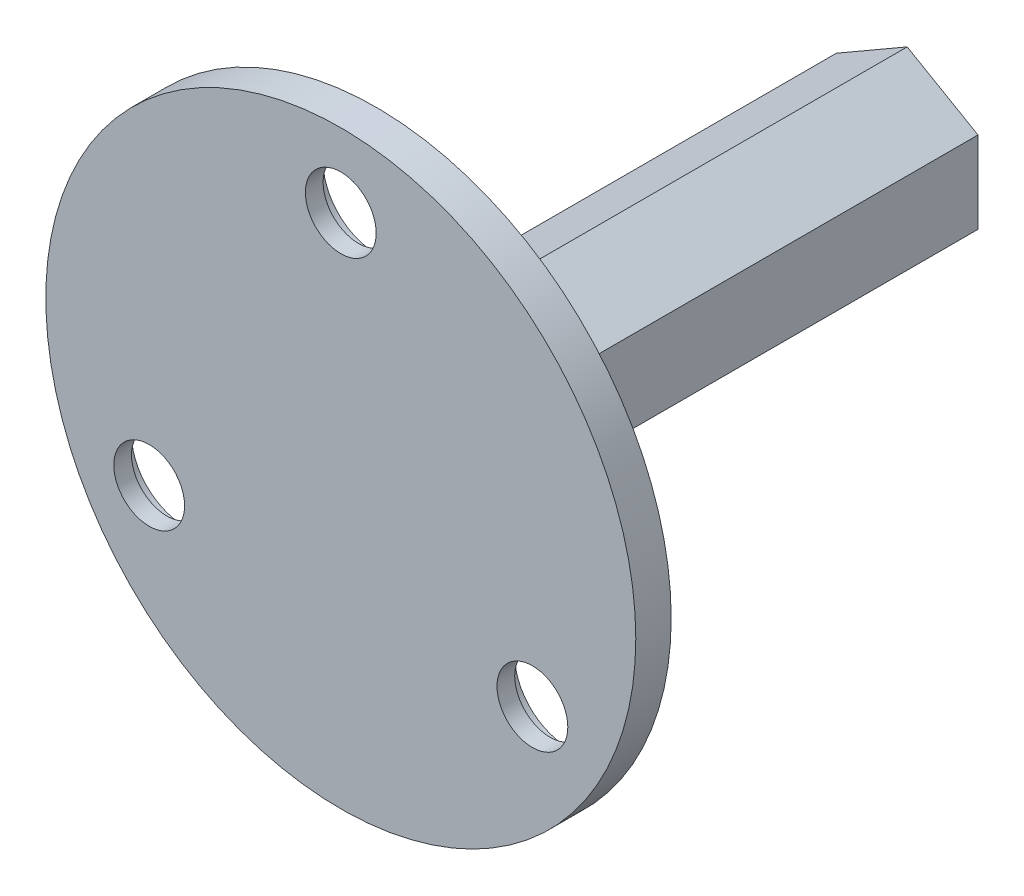
ISO-10303-21;
HEADER;
FILE_DESCRIPTION(('STEP AP214'),'2;1');
FILE_NAME('part.step','',(''),(''),'','','');
FILE_SCHEMA(('AUTOMOTIVE_DESIGN { 1 0 10303 214 1 1 1 1 }'));
ENDSEC;
DATA;
#1=APPLICATION_CONTEXT('core data for automotive mechanical design processes');
#2=APPLICATION_PROTOCOL_DEFINITION('international standard','automotive_design',2000,#1);
#3=PRODUCT_CONTEXT('',#1,'mechanical');
#4=PRODUCT('Part','Part','',(#3));
#5=PRODUCT_RELATED_PRODUCT_CATEGORY('part','',(#4));
#6=PRODUCT_DEFINITION_FORMATION('','',#4);
#7=PRODUCT_DEFINITION_CONTEXT('part definition',#1,'design');
#8=PRODUCT_DEFINITION('design','',#6,#7);
#9=PRODUCT_DEFINITION_SHAPE('','',#8);
#10=(LENGTH_UNIT() NAMED_UNIT(*) SI_UNIT(.MILLI.,.METRE.));
#11=(NAMED_UNIT(*) PLANE_ANGLE_UNIT() SI_UNIT($,.RADIAN.));
#12=(NAMED_UNIT(*) SI_UNIT($,.STERADIAN.) SOLID_ANGLE_UNIT());
#13=UNCERTAINTY_MEASURE_WITH_UNIT(LENGTH_MEASURE(1.E-05),#10,'distance_accuracy_value','');
#14=(GEOMETRIC_REPRESENTATION_CONTEXT(3) GLOBAL_UNCERTAINTY_ASSIGNED_CONTEXT((#13)) GLOBAL_UNIT_ASSIGNED_CONTEXT((#10,
#11,#12)) REPRESENTATION_CONTEXT('',''));
#15=CARTESIAN_POINT('',(0.,0.,0.));
#16=DIRECTION('',(0.,0.,1.));
#17=DIRECTION('',(1.,0.,0.));
#18=AXIS2_PLACEMENT_3D('',#15,#16,#17);
#19=CARTESIAN_POINT('',(-16.2379763209582,-9.37500000000001,3.));
#20=DIRECTION('',(0.,0.,-1.));
#21=DIRECTION('',(-1.,0.,0.));
#22=AXIS2_PLACEMENT_3D('',#19,#20,#21);
#23=CYLINDRICAL_SURFACE('',#22,3.);
#24=CARTESIAN_POINT('',(-16.2379763209582,-9.37500000000001,3.));
#25=DIRECTION('',(0.,0.,1.));
#26=DIRECTION('',(1.,0.,0.));
#27=AXIS2_PLACEMENT_3D('',#24,#25,#26);
#28=CIRCLE('',#27,3.);
#29=CARTESIAN_POINT('',(-13.2379763209582,-9.37500000000001,3.));
#30=VERTEX_POINT('',#29);
#31=EDGE_CURVE('E123',#30,#30,#28,.T.);
#32=ORIENTED_EDGE('',*,*,#31,.T.);
#33=EDGE_LOOP('',(#32));
#34=FACE_BOUND('',#33,.T.);
#35=CARTESIAN_POINT('',(-16.2379763209582,-9.37500000000001,1.5));
#36=DIRECTION('',(0.,0.,-1.));
#37=DIRECTION('',(-1.,0.,0.));
#38=AXIS2_PLACEMENT_3D('',#35,#36,#37);
#39=CIRCLE('',#38,3.);
#40=CARTESIAN_POINT('',(-19.2379763209582,-9.37500000000001,1.5));
#41=VERTEX_POINT('',#40);
#42=EDGE_CURVE('E43',#41,#41,#39,.T.);
#43=ORIENTED_EDGE('',*,*,#42,.T.);
#44=EDGE_LOOP('',(#43));
#45=FACE_BOUND('',#44,.T.);
#46=ADVANCED_FACE('F39',(#34,#45),#23,.F.);
#47=CARTESIAN_POINT('',(16.2379763209582,-9.37499999999999,3.));
#48=DIRECTION('',(0.,0.,-1.));
#49=DIRECTION('',(-1.,0.,0.));
#50=AXIS2_PLACEMENT_3D('',#47,#48,#49);
#51=CYLINDRICAL_SURFACE('',#50,3.);
#52=CARTESIAN_POINT('',(16.2379763209582,-9.37499999999999,3.));
#53=DIRECTION('',(0.,0.,1.));
#54=DIRECTION('',(1.,0.,0.));
#55=AXIS2_PLACEMENT_3D('',#52,#53,#54);
#56=CIRCLE('',#55,3.);
#57=CARTESIAN_POINT('',(19.2379763209582,-9.37499999999999,3.));
#58=VERTEX_POINT('',#57);
#59=EDGE_CURVE('E132',#58,#58,#56,.T.);
#60=ORIENTED_EDGE('',*,*,#59,.T.);
#61=EDGE_LOOP('',(#60));
#62=FACE_BOUND('',#61,.T.);
#63=CARTESIAN_POINT('',(16.2379763209582,-9.37499999999999,1.5));
#64=DIRECTION('',(0.,0.,-1.));
#65=DIRECTION('',(-1.,0.,0.));
#66=AXIS2_PLACEMENT_3D('',#63,#64,#65);
#67=CIRCLE('',#66,3.);
#68=CARTESIAN_POINT('',(13.2379763209582,-9.37499999999999,1.5));
#69=VERTEX_POINT('',#68);
#70=EDGE_CURVE('E154',#69,#69,#67,.T.);
#71=ORIENTED_EDGE('',*,*,#70,.T.);
#72=EDGE_LOOP('',(#71));
#73=FACE_BOUND('',#72,.T.);
#74=ADVANCED_FACE('F254',(#62,#73),#51,.F.);
#75=CARTESIAN_POINT('',(0.,18.75,3.));
#76=DIRECTION('',(0.,0.,-1.));
#77=DIRECTION('',(-1.,0.,0.));
#78=AXIS2_PLACEMENT_3D('',#75,#76,#77);
#79=CYLINDRICAL_SURFACE('',#78,3.);
#80=CARTESIAN_POINT('',(0.,18.75,3.));
#81=DIRECTION('',(0.,0.,1.));
#82=DIRECTION('',(1.,0.,0.));
#83=AXIS2_PLACEMENT_3D('',#80,#81,#82);
#84=CIRCLE('',#83,3.);
#85=CARTESIAN_POINT('',(3.,18.75,3.));
#86=VERTEX_POINT('',#85);
#87=EDGE_CURVE('E136',#86,#86,#84,.T.);
#88=ORIENTED_EDGE('',*,*,#87,.T.);
#89=EDGE_LOOP('',(#88));
#90=FACE_BOUND('',#89,.T.);
#91=CARTESIAN_POINT('',(0.,18.75,1.5));
#92=DIRECTION('',(0.,0.,-1.));
#93=DIRECTION('',(-1.,0.,0.));
#94=AXIS2_PLACEMENT_3D('',#91,#92,#93);
#95=CIRCLE('',#94,3.);
#96=CARTESIAN_POINT('',(-3.,18.75,1.5));
#97=VERTEX_POINT('',#96);
#98=EDGE_CURVE('E151',#97,#97,#95,.T.);
#99=ORIENTED_EDGE('',*,*,#98,.T.);
#100=EDGE_LOOP('',(#99));
#101=FACE_BOUND('',#100,.T.);
#102=ADVANCED_FACE('F261',(#90,#101),#79,.F.);
#103=CARTESIAN_POINT('',(0.,0.,0.));
#104=DIRECTION('',(0.,0.,1.));
#105=DIRECTION('',(1.,0.,0.));
#106=AXIS2_PLACEMENT_3D('',#103,#104,#105);
#107=PLANE('',#106);
#108=CARTESIAN_POINT('',(0.,0.,0.));
#109=DIRECTION('',(0.,0.,1.));
#110=DIRECTION('',(1.,0.,0.));
#111=AXIS2_PLACEMENT_3D('',#108,#109,#110);
#112=CIRCLE('',#111,7.5);
#113=CARTESIAN_POINT('',(7.5,0.,0.));
#114=VERTEX_POINT('',#113);
#115=EDGE_CURVE('E49',#114,#114,#112,.F.);
#116=ORIENTED_EDGE('',*,*,#115,.F.);
#117=EDGE_LOOP('',(#116));
#118=FACE_BOUND('',#117,.T.);
#119=CARTESIAN_POINT('',(0.,0.,0.));
#120=DIRECTION('',(0.,0.,-1.));
#121=DIRECTION('',(-1.,0.,0.));
#122=AXIS2_PLACEMENT_3D('',#119,#120,#121);
#123=CIRCLE('',#122,11.);
#124=CARTESIAN_POINT('',(-11.,0.,0.));
#125=VERTEX_POINT('',#124);
#126=EDGE_CURVE('E162',#125,#125,#123,.T.);
#127=ORIENTED_EDGE('',*,*,#126,.T.);
#128=EDGE_LOOP('',(#127));
#129=FACE_BOUND('',#128,.T.);
#130=ADVANCED_FACE('F270',(#118,#129),#107,.F.);
#131=CARTESIAN_POINT('',(0.,0.,-10.));
#132=DIRECTION('',(0.,0.,1.));
#133=DIRECTION('',(1.,0.,0.));
#134=AXIS2_PLACEMENT_3D('',#131,#132,#133);
#135=CYLINDRICAL_SURFACE('',#134,7.5);
#136=CARTESIAN_POINT('',(0.,0.,-10.));
#137=DIRECTION('',(0.,0.,-1.));
#138=DIRECTION('',(-1.,0.,0.));
#139=AXIS2_PLACEMENT_3D('',#136,#137,#138);
#140=CIRCLE('',#139,7.5);
#141=CARTESIAN_POINT('',(-7.5,0.,-10.));
#142=VERTEX_POINT('',#141);
#143=EDGE_CURVE('E118',#142,#142,#140,.T.);
#144=ORIENTED_EDGE('',*,*,#143,.F.);
#145=EDGE_LOOP('',(#144));
#146=FACE_BOUND('',#145,.T.);
#147=ORIENTED_EDGE('',*,*,#115,.T.);
#148=EDGE_LOOP('',(#147));
#149=FACE_BOUND('',#148,.T.);
#150=ADVANCED_FACE('F265',(#146,#149),#135,.T.);
#151=CARTESIAN_POINT('',(0.,0.,-10.));
#152=DIRECTION('',(0.,0.,-1.));
#153=DIRECTION('',(-1.,0.,0.));
#154=AXIS2_PLACEMENT_3D('',#151,#152,#153);
#155=PLANE('',#154);
#156=DIRECTION('',(-0.866025403784439,-0.5,0.));
#157=VECTOR('',#156,1.);
#158=CARTESIAN_POINT('',(6.,-3.46410161513776,-10.));
#159=LINE('',#158,#157);
#160=CARTESIAN_POINT('',(6.,-3.46410161513776,-10.));
#161=VERTEX_POINT('',#160);
#162=CARTESIAN_POINT('',(0.,-6.92820323027551,-10.));
#163=VERTEX_POINT('',#162);
#164=EDGE_CURVE('E57',#161,#163,#159,.T.);
#165=ORIENTED_EDGE('',*,*,#164,.F.);
#166=DIRECTION('',(0.,-1.,0.));
#167=VECTOR('',#166,1.);
#168=CARTESIAN_POINT('',(6.,3.46410161513776,-10.));
#169=LINE('',#168,#167);
#170=CARTESIAN_POINT('',(6.,3.46410161513776,-10.));
#171=VERTEX_POINT('',#170);
#172=EDGE_CURVE('E61',#171,#161,#169,.T.);
#173=ORIENTED_EDGE('',*,*,#172,.F.);
#174=DIRECTION('',(0.866025403784439,-0.5,0.));
#175=VECTOR('',#174,1.);
#176=CARTESIAN_POINT('',(0.,6.92820323027551,-10.));
#177=LINE('',#176,#175);
#178=CARTESIAN_POINT('',(0.,6.92820323027551,-10.));
#179=VERTEX_POINT('',#178);
#180=EDGE_CURVE('E212',#179,#171,#177,.T.);
#181=ORIENTED_EDGE('',*,*,#180,.F.);
#182=DIRECTION('',(0.866025403784439,0.5,0.));
#183=VECTOR('',#182,1.);
#184=CARTESIAN_POINT('',(-6.,3.46410161513776,-10.));
#185=LINE('',#184,#183);
#186=CARTESIAN_POINT('',(-6.,3.46410161513776,-10.));
#187=VERTEX_POINT('',#186);
#188=EDGE_CURVE('E208',#187,#179,#185,.T.);
#189=ORIENTED_EDGE('',*,*,#188,.F.);
#190=DIRECTION('',(0.,1.,0.));
#191=VECTOR('',#190,1.);
#192=CARTESIAN_POINT('',(-6.,-3.46410161513775,-10.));
#193=LINE('',#192,#191);
#194=CARTESIAN_POINT('',(-6.,-3.46410161513775,-10.));
#195=VERTEX_POINT('',#194);
#196=EDGE_CURVE('E204',#195,#187,#193,.T.);
#197=ORIENTED_EDGE('',*,*,#196,.F.);
#198=DIRECTION('',(-0.866025403784438,0.5,0.));
#199=VECTOR('',#198,1.);
#200=CARTESIAN_POINT('',(0.,-6.92820323027551,-10.));
#201=LINE('',#200,#199);
#202=EDGE_CURVE('E201',#163,#195,#201,.T.);
#203=ORIENTED_EDGE('',*,*,#202,.F.);
#204=EDGE_LOOP('',(#165,#173,#181,#189,#197,#203));
#205=FACE_BOUND('',#204,.T.);
#206=ORIENTED_EDGE('',*,*,#143,.T.);
#207=EDGE_LOOP('',(#206));
#208=FACE_BOUND('',#207,.T.);
#209=ADVANCED_FACE('F235',(#205,#208),#155,.T.);
#210=CARTESIAN_POINT('',(6.,-3.46410161513776,-45.));
#211=DIRECTION('',(-0.5,0.866025403784439,0.));
#212=DIRECTION('',(-0.866025403784439,-0.5,0.));
#213=AXIS2_PLACEMENT_3D('',#210,#211,#212);
#214=PLANE('',#213);
#215=ORIENTED_EDGE('',*,*,#164,.T.);
#216=DIRECTION('',(0.,0.,1.));
#217=VECTOR('',#216,1.);
#218=CARTESIAN_POINT('',(0.,-6.92820323027551,-45.));
#219=LINE('',#218,#217);
#220=CARTESIAN_POINT('',(0.,-6.92820323027551,-45.));
#221=VERTEX_POINT('',#220);
#222=EDGE_CURVE('E98',#221,#163,#219,.T.);
#223=ORIENTED_EDGE('',*,*,#222,.F.);
#224=DIRECTION('',(-0.866025403784439,-0.5,0.));
#225=VECTOR('',#224,1.);
#226=CARTESIAN_POINT('',(6.,-3.46410161513776,-45.));
#227=LINE('',#226,#225);
#228=CARTESIAN_POINT('',(6.,-3.46410161513776,-45.));
#229=VERTEX_POINT('',#228);
#230=EDGE_CURVE('E105',#229,#221,#227,.T.);
#231=ORIENTED_EDGE('',*,*,#230,.F.);
#232=DIRECTION('',(0.,0.,1.));
#233=VECTOR('',#232,1.);
#234=CARTESIAN_POINT('',(6.,-3.46410161513776,-45.));
#235=LINE('',#234,#233);
#236=EDGE_CURVE('E198',#229,#161,#235,.T.);
#237=ORIENTED_EDGE('',*,*,#236,.T.);
#238=EDGE_LOOP('',(#215,#223,#231,#237));
#239=FACE_BOUND('',#238,.T.);
#240=ADVANCED_FACE('F116',(#239),#214,.F.);
#241=CARTESIAN_POINT('',(0.,-6.92820323027551,-45.));
#242=DIRECTION('',(0.5,0.866025403784438,0.));
#243=DIRECTION('',(-0.866025403784438,0.5,0.));
#244=AXIS2_PLACEMENT_3D('',#241,#242,#243);
#245=PLANE('',#244);
#246=ORIENTED_EDGE('',*,*,#202,.T.);
#247=DIRECTION('',(0.,0.,1.));
#248=VECTOR('',#247,1.);
#249=CARTESIAN_POINT('',(-6.,-3.46410161513775,-45.));
#250=LINE('',#249,#248);
#251=CARTESIAN_POINT('',(-6.,-3.46410161513775,-45.));
#252=VERTEX_POINT('',#251);
#253=EDGE_CURVE('E100',#252,#195,#250,.T.);
#254=ORIENTED_EDGE('',*,*,#253,.F.);
#255=DIRECTION('',(-0.866025403784438,0.5,0.));
#256=VECTOR('',#255,1.);
#257=CARTESIAN_POINT('',(0.,-6.92820323027551,-45.));
#258=LINE('',#257,#256);
#259=EDGE_CURVE('E93',#221,#252,#258,.T.);
#260=ORIENTED_EDGE('',*,*,#259,.F.);
#261=ORIENTED_EDGE('',*,*,#222,.T.);
#262=EDGE_LOOP('',(#246,#254,#260,#261));
#263=FACE_BOUND('',#262,.T.);
#264=ADVANCED_FACE('F96',(#263),#245,.F.);
#265=CARTESIAN_POINT('',(-6.,-3.46410161513775,-45.));
#266=DIRECTION('',(1.,0.,0.));
#267=DIRECTION('',(0.,1.,0.));
#268=AXIS2_PLACEMENT_3D('',#265,#266,#267);
#269=PLANE('',#268);
#270=ORIENTED_EDGE('',*,*,#196,.T.);
#271=DIRECTION('',(0.,0.,1.));
#272=VECTOR('',#271,1.);
#273=CARTESIAN_POINT('',(-6.,3.46410161513776,-45.));
#274=LINE('',#273,#272);
#275=CARTESIAN_POINT('',(-6.,3.46410161513776,-45.));
#276=VERTEX_POINT('',#275);
#277=EDGE_CURVE('E125',#276,#187,#274,.T.);
#278=ORIENTED_EDGE('',*,*,#277,.F.);
#279=DIRECTION('',(0.,1.,0.));
#280=VECTOR('',#279,1.);
#281=CARTESIAN_POINT('',(-6.,-3.46410161513775,-45.));
#282=LINE('',#281,#280);
#283=EDGE_CURVE('E104',#252,#276,#282,.T.);
#284=ORIENTED_EDGE('',*,*,#283,.F.);
#285=ORIENTED_EDGE('',*,*,#253,.T.);
#286=EDGE_LOOP('',(#270,#278,#284,#285));
#287=FACE_BOUND('',#286,.T.);
#288=ADVANCED_FACE('F234',(#287),#269,.F.);
#289=CARTESIAN_POINT('',(-6.,3.46410161513776,-45.));
#290=DIRECTION('',(0.5,-0.866025403784439,0.));
#291=DIRECTION('',(0.866025403784439,0.5,0.));
#292=AXIS2_PLACEMENT_3D('',#289,#290,#291);
#293=PLANE('',#292);
#294=ORIENTED_EDGE('',*,*,#188,.T.);
#295=DIRECTION('',(0.,0.,1.));
#296=VECTOR('',#295,1.);
#297=CARTESIAN_POINT('',(0.,6.92820323027551,-45.));
#298=LINE('',#297,#296);
#299=CARTESIAN_POINT('',(0.,6.92820323027551,-45.));
#300=VERTEX_POINT('',#299);
#301=EDGE_CURVE('E223',#300,#179,#298,.T.);
#302=ORIENTED_EDGE('',*,*,#301,.F.);
#303=DIRECTION('',(0.866025403784439,0.5,0.));
#304=VECTOR('',#303,1.);
#305=CARTESIAN_POINT('',(-6.,3.46410161513776,-45.));
#306=LINE('',#305,#304);
#307=EDGE_CURVE('E190',#276,#300,#306,.T.);
#308=ORIENTED_EDGE('',*,*,#307,.F.);
#309=ORIENTED_EDGE('',*,*,#277,.T.);
#310=EDGE_LOOP('',(#294,#302,#308,#309));
#311=FACE_BOUND('',#310,.T.);
#312=ADVANCED_FACE('F231',(#311),#293,.F.);
#313=CARTESIAN_POINT('',(0.,6.92820323027551,-45.));
#314=DIRECTION('',(-0.5,-0.866025403784439,0.));
#315=DIRECTION('',(0.866025403784439,-0.5,0.));
#316=AXIS2_PLACEMENT_3D('',#313,#314,#315);
#317=PLANE('',#316);
#318=ORIENTED_EDGE('',*,*,#180,.T.);
#319=DIRECTION('',(0.,0.,1.));
#320=VECTOR('',#319,1.);
#321=CARTESIAN_POINT('',(6.,3.46410161513776,-45.));
#322=LINE('',#321,#320);
#323=CARTESIAN_POINT('',(6.,3.46410161513776,-45.));
#324=VERTEX_POINT('',#323);
#325=EDGE_CURVE('E219',#324,#171,#322,.T.);
#326=ORIENTED_EDGE('',*,*,#325,.F.);
#327=DIRECTION('',(0.866025403784439,-0.5,0.));
#328=VECTOR('',#327,1.);
#329=CARTESIAN_POINT('',(0.,6.92820323027551,-45.));
#330=LINE('',#329,#328);
#331=EDGE_CURVE('E193',#300,#324,#330,.T.);
#332=ORIENTED_EDGE('',*,*,#331,.F.);
#333=ORIENTED_EDGE('',*,*,#301,.T.);
#334=EDGE_LOOP('',(#318,#326,#332,#333));
#335=FACE_BOUND('',#334,.T.);
#336=ADVANCED_FACE('F239',(#335),#317,.F.);
#337=CARTESIAN_POINT('',(6.,3.46410161513776,-45.));
#338=DIRECTION('',(-1.,0.,0.));
#339=DIRECTION('',(0.,0.,1.));
#340=AXIS2_PLACEMENT_3D('',#337,#338,#339);
#341=PLANE('',#340);
#342=ORIENTED_EDGE('',*,*,#172,.T.);
#343=ORIENTED_EDGE('',*,*,#236,.F.);
#344=DIRECTION('',(0.,-1.,0.));
#345=VECTOR('',#344,1.);
#346=CARTESIAN_POINT('',(6.,3.46410161513776,-45.));
#347=LINE('',#346,#345);
#348=EDGE_CURVE('E110',#324,#229,#347,.T.);
#349=ORIENTED_EDGE('',*,*,#348,.F.);
#350=ORIENTED_EDGE('',*,*,#325,.T.);
#351=EDGE_LOOP('',(#342,#343,#349,#350));
#352=FACE_BOUND('',#351,.T.);
#353=ADVANCED_FACE('F242',(#352),#341,.F.);
#354=CARTESIAN_POINT('',(0.,0.,-45.));
#355=DIRECTION('',(0.,0.,-1.));
#356=DIRECTION('',(-1.,0.,0.));
#357=AXIS2_PLACEMENT_3D('',#354,#355,#356);
#358=PLANE('',#357);
#359=CARTESIAN_POINT('',(0.,0.,-45.));
#360=DIRECTION('',(0.,0.,-1.));
#361=DIRECTION('',(-1.,0.,0.));
#362=AXIS2_PLACEMENT_3D('',#359,#360,#361);
#363=CIRCLE('',#362,1.25);
#364=CARTESIAN_POINT('',(-1.25,0.,-45.));
#365=VERTEX_POINT('',#364);
#366=EDGE_CURVE('E180',#365,#365,#363,.T.);
#367=ORIENTED_EDGE('',*,*,#366,.F.);
#368=EDGE_LOOP('',(#367));
#369=FACE_BOUND('',#368,.T.);
#370=ORIENTED_EDGE('',*,*,#230,.T.);
#371=ORIENTED_EDGE('',*,*,#259,.T.);
#372=ORIENTED_EDGE('',*,*,#283,.T.);
#373=ORIENTED_EDGE('',*,*,#307,.T.);
#374=ORIENTED_EDGE('',*,*,#331,.T.);
#375=ORIENTED_EDGE('',*,*,#348,.T.);
#376=EDGE_LOOP('',(#370,#371,#372,#373,#374,#375));
#377=FACE_BOUND('',#376,.T.);
#378=ADVANCED_FACE('F108',(#369,#377),#358,.T.);
#379=CARTESIAN_POINT('',(0.,0.,-35.));
#380=DIRECTION('',(0.,0.,-1.));
#381=DIRECTION('',(-1.,0.,0.));
#382=AXIS2_PLACEMENT_3D('',#379,#380,#381);
#383=CYLINDRICAL_SURFACE('',#382,1.25);
#384=CARTESIAN_POINT('',(0.,0.,-35.));
#385=DIRECTION('',(0.,0.,-1.));
#386=DIRECTION('',(-1.,0.,0.));
#387=AXIS2_PLACEMENT_3D('',#384,#385,#386);
#388=CIRCLE('',#387,1.25);
#389=CARTESIAN_POINT('',(-1.25,0.,-35.));
#390=VERTEX_POINT('',#389);
#391=EDGE_CURVE('E181',#390,#390,#388,.T.);
#392=ORIENTED_EDGE('',*,*,#391,.F.);
#393=EDGE_LOOP('',(#392));
#394=FACE_BOUND('',#393,.T.);
#395=ORIENTED_EDGE('',*,*,#366,.T.);
#396=EDGE_LOOP('',(#395));
#397=FACE_BOUND('',#396,.T.);
#398=ADVANCED_FACE('F249',(#394,#397),#383,.F.);
#399=CARTESIAN_POINT('',(0.,0.,-35.));
#400=DIRECTION('',(0.,0.,-1.));
#401=DIRECTION('',(-1.,0.,0.));
#402=AXIS2_PLACEMENT_3D('',#399,#400,#401);
#403=PLANE('',#402);
#404=ORIENTED_EDGE('',*,*,#391,.T.);
#405=EDGE_LOOP('',(#404));
#406=FACE_BOUND('',#405,.T.);
#407=ADVANCED_FACE('F342',(#406),#403,.T.);
#408=CARTESIAN_POINT('',(0.,0.,-0.5));
#409=DIRECTION('',(0.,0.,-1.));
#410=DIRECTION('',(-1.,0.,0.));
#411=AXIS2_PLACEMENT_3D('',#408,#409,#410);
#412=PLANE('',#411);
#413=CARTESIAN_POINT('',(0.,0.,-0.5));
#414=DIRECTION('',(0.,0.,-1.));
#415=DIRECTION('',(-1.,0.,0.));
#416=AXIS2_PLACEMENT_3D('',#413,#414,#415);
#417=CIRCLE('',#416,12.5);
#418=CARTESIAN_POINT('',(-12.5,0.,-0.5));
#419=VERTEX_POINT('',#418);
#420=EDGE_CURVE('E173',#419,#419,#417,.T.);
#421=ORIENTED_EDGE('',*,*,#420,.T.);
#422=EDGE_LOOP('',(#421));
#423=FACE_BOUND('',#422,.T.);
#424=CARTESIAN_POINT('',(0.,0.,-0.5));
#425=DIRECTION('',(0.,0.,-1.));
#426=DIRECTION('',(-1.,0.,0.));
#427=AXIS2_PLACEMENT_3D('',#424,#425,#426);
#428=CIRCLE('',#427,11.);
#429=CARTESIAN_POINT('',(-11.,0.,-0.5));
#430=VERTEX_POINT('',#429);
#431=EDGE_CURVE('E167',#430,#430,#428,.T.);
#432=ORIENTED_EDGE('',*,*,#431,.F.);
#433=EDGE_LOOP('',(#432));
#434=FACE_BOUND('',#433,.T.);
#435=ADVANCED_FACE('F351',(#423,#434),#412,.T.);
#436=CARTESIAN_POINT('',(0.,0.,-0.5));
#437=DIRECTION('',(0.,0.,1.));
#438=DIRECTION('',(1.,0.,0.));
#439=AXIS2_PLACEMENT_3D('',#436,#437,#438);
#440=CYLINDRICAL_SURFACE('',#439,12.5);
#441=ORIENTED_EDGE('',*,*,#420,.F.);
#442=EDGE_LOOP('',(#441));
#443=FACE_BOUND('',#442,.T.);
#444=CARTESIAN_POINT('',(0.,0.,0.));
#445=DIRECTION('',(0.,0.,1.));
#446=DIRECTION('',(1.,0.,0.));
#447=AXIS2_PLACEMENT_3D('',#444,#445,#446);
#448=CIRCLE('',#447,12.5);
#449=CARTESIAN_POINT('',(12.5,0.,0.));
#450=VERTEX_POINT('',#449);
#451=EDGE_CURVE('E11',#450,#450,#448,.F.);
#452=ORIENTED_EDGE('',*,*,#451,.T.);
#453=EDGE_LOOP('',(#452));
#454=FACE_BOUND('',#453,.T.);
#455=ADVANCED_FACE('F360',(#443,#454),#440,.T.);
#456=CARTESIAN_POINT('',(0.,0.,-0.5));
#457=DIRECTION('',(0.,0.,1.));
#458=DIRECTION('',(1.,0.,0.));
#459=AXIS2_PLACEMENT_3D('',#456,#457,#458);
#460=CYLINDRICAL_SURFACE('',#459,11.);
#461=ORIENTED_EDGE('',*,*,#431,.T.);
#462=EDGE_LOOP('',(#461));
#463=FACE_BOUND('',#462,.T.);
#464=ORIENTED_EDGE('',*,*,#126,.F.);
#465=EDGE_LOOP('',(#464));
#466=FACE_BOUND('',#465,.T.);
#467=ADVANCED_FACE('F274',(#463,#466),#460,.F.);
#468=CARTESIAN_POINT('',(0.,0.,3.));
#469=DIRECTION('',(0.,0.,1.));
#470=DIRECTION('',(1.,0.,0.));
#471=AXIS2_PLACEMENT_3D('',#468,#469,#470);
#472=PLANE('',#471);
#473=ORIENTED_EDGE('',*,*,#59,.F.);
#474=EDGE_LOOP('',(#473));
#475=FACE_BOUND('',#474,.T.);
#476=CARTESIAN_POINT('',(0.,0.,3.));
#477=DIRECTION('',(0.,0.,1.));
#478=DIRECTION('',(1.,0.,0.));
#479=AXIS2_PLACEMENT_3D('',#476,#477,#478);
#480=CIRCLE('',#479,25.);
#481=CARTESIAN_POINT('',(25.,0.,3.));
#482=VERTEX_POINT('',#481);
#483=EDGE_CURVE('E141',#482,#482,#480,.T.);
#484=ORIENTED_EDGE('',*,*,#483,.T.);
#485=EDGE_LOOP('',(#484));
#486=FACE_BOUND('',#485,.T.);
#487=ORIENTED_EDGE('',*,*,#87,.F.);
#488=EDGE_LOOP('',(#487));
#489=FACE_BOUND('',#488,.T.);
#490=ORIENTED_EDGE('',*,*,#31,.F.);
#491=EDGE_LOOP('',(#490));
#492=FACE_BOUND('',#491,.T.);
#493=ADVANCED_FACE('F272',(#475,#486,#489,#492),#472,.T.);
#494=CARTESIAN_POINT('',(0.,0.,3.));
#495=DIRECTION('',(0.,0.,-1.));
#496=DIRECTION('',(-1.,0.,0.));
#497=AXIS2_PLACEMENT_3D('',#494,#495,#496);
#498=CYLINDRICAL_SURFACE('',#497,25.);
#499=ORIENTED_EDGE('',*,*,#483,.F.);
#500=EDGE_LOOP('',(#499));
#501=FACE_BOUND('',#500,.T.);
#502=CARTESIAN_POINT('',(0.,0.,0.));
#503=DIRECTION('',(0.,0.,1.));
#504=DIRECTION('',(1.,0.,0.));
#505=AXIS2_PLACEMENT_3D('',#502,#503,#504);
#506=CIRCLE('',#505,25.);
#507=CARTESIAN_POINT('',(25.,0.,0.));
#508=VERTEX_POINT('',#507);
#509=EDGE_CURVE('E140',#508,#508,#506,.T.);
#510=ORIENTED_EDGE('',*,*,#509,.T.);
#511=EDGE_LOOP('',(#510));
#512=FACE_BOUND('',#511,.T.);
#513=ADVANCED_FACE('F41',(#501,#512),#498,.T.);
#514=CARTESIAN_POINT('',(0.,18.75,0.));
#515=DIRECTION('',(0.,0.,-1.));
#516=DIRECTION('',(-1.,0.,0.));
#517=AXIS2_PLACEMENT_3D('',#514,#515,#516);
#518=CIRCLE('',#517,4.5);
#519=CARTESIAN_POINT('',(-4.5,18.75,0.));
#520=VERTEX_POINT('',#519);
#521=EDGE_CURVE('E503',#520,#520,#518,.T.);
#522=ORIENTED_EDGE('',*,*,#521,.F.);
#523=EDGE_LOOP('',(#522));
#524=FACE_BOUND('',#523,.T.);
#525=CARTESIAN_POINT('',(-16.2379763209582,-9.37500000000001,0.));
#526=DIRECTION('',(0.,0.,-1.));
#527=DIRECTION('',(-1.,0.,0.));
#528=AXIS2_PLACEMENT_3D('',#525,#526,#527);
#529=CIRCLE('',#528,4.5);
#530=CARTESIAN_POINT('',(-20.7379763209582,-9.37500000000001,0.));
#531=VERTEX_POINT('',#530);
#532=EDGE_CURVE('E513',#531,#531,#529,.T.);
#533=ORIENTED_EDGE('',*,*,#532,.F.);
#534=EDGE_LOOP('',(#533));
#535=FACE_BOUND('',#534,.T.);
#536=CARTESIAN_POINT('',(16.2379763209582,-9.37499999999999,0.));
#537=DIRECTION('',(0.,0.,-1.));
#538=DIRECTION('',(-1.,0.,0.));
#539=AXIS2_PLACEMENT_3D('',#536,#537,#538);
#540=CIRCLE('',#539,4.5);
#541=CARTESIAN_POINT('',(11.7379763209582,-9.37499999999999,0.));
#542=VERTEX_POINT('',#541);
#543=EDGE_CURVE('E520',#542,#542,#540,.T.);
#544=ORIENTED_EDGE('',*,*,#543,.F.);
#545=EDGE_LOOP('',(#544));
#546=FACE_BOUND('',#545,.T.);
#547=ORIENTED_EDGE('',*,*,#451,.F.);
#548=EDGE_LOOP('',(#547));
#549=FACE_BOUND('',#548,.T.);
#550=ORIENTED_EDGE('',*,*,#509,.F.);
#551=EDGE_LOOP('',(#550));
#552=FACE_BOUND('',#551,.T.);
#553=ADVANCED_FACE('F276',(#524,#535,#546,#549,#552),#107,.F.);
#554=CARTESIAN_POINT('',(16.2379763209582,-9.37499999999999,1.5));
#555=DIRECTION('',(0.,0.,-1.));
#556=DIRECTION('',(-1.,0.,0.));
#557=AXIS2_PLACEMENT_3D('',#554,#555,#556);
#558=CYLINDRICAL_SURFACE('',#557,4.5);
#559=CARTESIAN_POINT('',(16.2379763209582,-9.37499999999999,1.5));
#560=DIRECTION('',(0.,0.,-1.));
#561=DIRECTION('',(-1.,0.,0.));
#562=AXIS2_PLACEMENT_3D('',#559,#560,#561);
#563=CIRCLE('',#562,4.5);
#564=CARTESIAN_POINT('',(11.7379763209582,-9.37499999999999,1.5));
#565=VERTEX_POINT('',#564);
#566=EDGE_CURVE('E517',#565,#565,#563,.T.);
#567=ORIENTED_EDGE('',*,*,#566,.F.);
#568=EDGE_LOOP('',(#567));
#569=FACE_BOUND('',#568,.T.);
#570=ORIENTED_EDGE('',*,*,#543,.T.);
#571=EDGE_LOOP('',(#570));
#572=FACE_BOUND('',#571,.T.);
#573=ADVANCED_FACE('F278',(#569,#572),#558,.F.);
#574=CARTESIAN_POINT('',(16.2379763209582,-9.37499999999999,1.5));
#575=DIRECTION('',(0.,0.,-1.));
#576=DIRECTION('',(-1.,0.,0.));
#577=AXIS2_PLACEMENT_3D('',#574,#575,#576);
#578=PLANE('',#577);
#579=ORIENTED_EDGE('',*,*,#70,.F.);
#580=EDGE_LOOP('',(#579));
#581=FACE_BOUND('',#580,.T.);
#582=ORIENTED_EDGE('',*,*,#566,.T.);
#583=EDGE_LOOP('',(#582));
#584=FACE_BOUND('',#583,.T.);
#585=ADVANCED_FACE('F284',(#581,#584),#578,.T.);
#586=CARTESIAN_POINT('',(-16.2379763209582,-9.37500000000001,1.5));
#587=DIRECTION('',(0.,0.,-1.));
#588=DIRECTION('',(-1.,0.,0.));
#589=AXIS2_PLACEMENT_3D('',#586,#587,#588);
#590=CYLINDRICAL_SURFACE('',#589,4.5);
#591=CARTESIAN_POINT('',(-16.2379763209582,-9.37500000000001,1.5));
#592=DIRECTION('',(0.,0.,-1.));
#593=DIRECTION('',(-1.,0.,0.));
#594=AXIS2_PLACEMENT_3D('',#591,#592,#593);
#595=CIRCLE('',#594,4.5);
#596=CARTESIAN_POINT('',(-20.7379763209582,-9.37500000000001,1.5));
#597=VERTEX_POINT('',#596);
#598=EDGE_CURVE('E507',#597,#597,#595,.T.);
#599=ORIENTED_EDGE('',*,*,#598,.F.);
#600=EDGE_LOOP('',(#599));
#601=FACE_BOUND('',#600,.T.);
#602=ORIENTED_EDGE('',*,*,#532,.T.);
#603=EDGE_LOOP('',(#602));
#604=FACE_BOUND('',#603,.T.);
#605=ADVANCED_FACE('F384',(#601,#604),#590,.F.);
#606=CARTESIAN_POINT('',(-16.2379763209582,-9.37500000000001,1.5));
#607=DIRECTION('',(0.,0.,-1.));
#608=DIRECTION('',(-1.,0.,0.));
#609=AXIS2_PLACEMENT_3D('',#606,#607,#608);
#610=PLANE('',#609);
#611=ORIENTED_EDGE('',*,*,#42,.F.);
#612=EDGE_LOOP('',(#611));
#613=FACE_BOUND('',#612,.T.);
#614=ORIENTED_EDGE('',*,*,#598,.T.);
#615=EDGE_LOOP('',(#614));
#616=FACE_BOUND('',#615,.T.);
#617=ADVANCED_FACE('F392',(#613,#616),#610,.T.);
#618=CARTESIAN_POINT('',(0.,18.75,1.5));
#619=DIRECTION('',(0.,0.,-1.));
#620=DIRECTION('',(-1.,0.,0.));
#621=AXIS2_PLACEMENT_3D('',#618,#619,#620);
#622=CYLINDRICAL_SURFACE('',#621,4.5);
#623=CARTESIAN_POINT('',(0.,18.75,1.5));
#624=DIRECTION('',(0.,0.,-1.));
#625=DIRECTION('',(-1.,0.,0.));
#626=AXIS2_PLACEMENT_3D('',#623,#624,#625);
#627=CIRCLE('',#626,4.5);
#628=CARTESIAN_POINT('',(-4.5,18.75,1.5));
#629=VERTEX_POINT('',#628);
#630=EDGE_CURVE('E155',#629,#629,#627,.T.);
#631=ORIENTED_EDGE('',*,*,#630,.F.);
#632=EDGE_LOOP('',(#631));
#633=FACE_BOUND('',#632,.T.);
#634=ORIENTED_EDGE('',*,*,#521,.T.);
#635=EDGE_LOOP('',(#634));
#636=FACE_BOUND('',#635,.T.);
#637=ADVANCED_FACE('F400',(#633,#636),#622,.F.);
#638=CARTESIAN_POINT('',(0.,18.75,1.5));
#639=DIRECTION('',(0.,0.,-1.));
#640=DIRECTION('',(-1.,0.,0.));
#641=AXIS2_PLACEMENT_3D('',#638,#639,#640);
#642=PLANE('',#641);
#643=ORIENTED_EDGE('',*,*,#98,.F.);
#644=EDGE_LOOP('',(#643));
#645=FACE_BOUND('',#644,.T.);
#646=ORIENTED_EDGE('',*,*,#630,.T.);
#647=EDGE_LOOP('',(#646));
#648=FACE_BOUND('',#647,.T.);
#649=ADVANCED_FACE('F408',(#645,#648),#642,.T.);
#650=CLOSED_SHELL('',(#46,#74,#102,#130,#150,#209,#240,#264,#288,#312,#336,#353,#378,#398,#407,
#435,#455,#467,#493,#513,#553,#573,#585,#605,#617,#637,#649));
#651=MANIFOLD_SOLID_BREP('B2',#650);
#652=ADVANCED_BREP_SHAPE_REPRESENTATION('',(#18,#651),#14);
#653=SHAPE_DEFINITION_REPRESENTATION(#9,#652);
ENDSEC;
END-ISO-10303-21;
